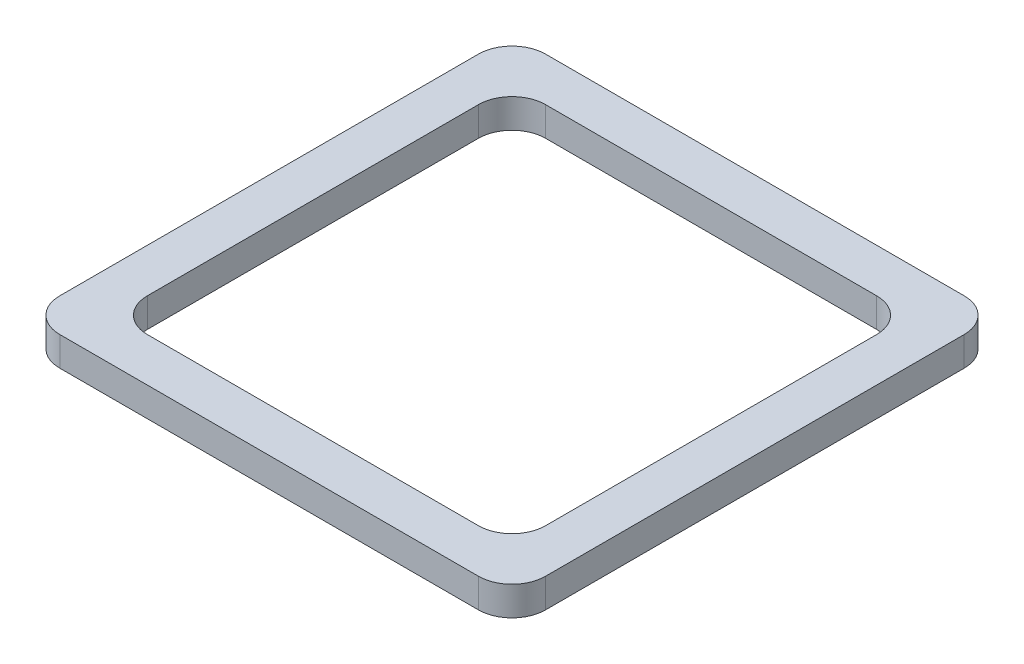
ISO-10303-21;
HEADER;
FILE_DESCRIPTION(('STEP AP214'),'2;1');
FILE_NAME('part.step','',(''),(''),'','','');
FILE_SCHEMA(('AUTOMOTIVE_DESIGN { 1 0 10303 214 1 1 1 1 }'));
ENDSEC;
DATA;
#1=APPLICATION_CONTEXT('core data for automotive mechanical design processes');
#2=APPLICATION_PROTOCOL_DEFINITION('international standard','automotive_design',2000,#1);
#3=PRODUCT_CONTEXT('',#1,'mechanical');
#4=PRODUCT('Part','Part','',(#3));
#5=PRODUCT_RELATED_PRODUCT_CATEGORY('part','',(#4));
#6=PRODUCT_DEFINITION_FORMATION('','',#4);
#7=PRODUCT_DEFINITION_CONTEXT('part definition',#1,'design');
#8=PRODUCT_DEFINITION('design','',#6,#7);
#9=PRODUCT_DEFINITION_SHAPE('','',#8);
#10=(LENGTH_UNIT() NAMED_UNIT(*) SI_UNIT(.MILLI.,.METRE.));
#11=(NAMED_UNIT(*) PLANE_ANGLE_UNIT() SI_UNIT($,.RADIAN.));
#12=(NAMED_UNIT(*) SI_UNIT($,.STERADIAN.) SOLID_ANGLE_UNIT());
#13=UNCERTAINTY_MEASURE_WITH_UNIT(LENGTH_MEASURE(1.E-05),#10,'distance_accuracy_value','');
#14=(GEOMETRIC_REPRESENTATION_CONTEXT(3) GLOBAL_UNCERTAINTY_ASSIGNED_CONTEXT((#13)) GLOBAL_UNIT_ASSIGNED_CONTEXT((#10,
#11,#12)) REPRESENTATION_CONTEXT('',''));
#15=CARTESIAN_POINT('',(0.,0.,0.));
#16=DIRECTION('',(0.,0.,1.));
#17=DIRECTION('',(1.,0.,0.));
#18=AXIS2_PLACEMENT_3D('',#15,#16,#17);
#19=CARTESIAN_POINT('',(0.,1.,8.325));
#20=DIRECTION('',(0.,0.,-1.));
#21=DIRECTION('',(-1.,0.,0.));
#22=AXIS2_PLACEMENT_3D('',#19,#20,#21);
#23=PLANE('',#22);
#24=DIRECTION('',(1.,0.,0.));
#25=VECTOR('',#24,1.);
#26=CARTESIAN_POINT('',(0.,1.,8.325));
#27=LINE('',#26,#25);
#28=CARTESIAN_POINT('',(-7.175,1.,8.325));
#29=VERTEX_POINT('',#28);
#30=CARTESIAN_POINT('',(7.175,1.,8.325));
#31=VERTEX_POINT('',#30);
#32=EDGE_CURVE('E191',#29,#31,#27,.T.);
#33=ORIENTED_EDGE('',*,*,#32,.F.);
#34=DIRECTION('',(0.,-1.,0.));
#35=VECTOR('',#34,1.);
#36=CARTESIAN_POINT('',(-7.175,0.,8.325));
#37=LINE('',#36,#35);
#38=CARTESIAN_POINT('',(-7.175,0.,8.325));
#39=VERTEX_POINT('',#38);
#40=EDGE_CURVE('E268',#29,#39,#37,.T.);
#41=ORIENTED_EDGE('',*,*,#40,.T.);
#42=DIRECTION('',(1.,0.,0.));
#43=VECTOR('',#42,1.);
#44=CARTESIAN_POINT('',(0.,0.,8.325));
#45=LINE('',#44,#43);
#46=CARTESIAN_POINT('',(7.175,0.,8.325));
#47=VERTEX_POINT('',#46);
#48=EDGE_CURVE('E219',#39,#47,#45,.T.);
#49=ORIENTED_EDGE('',*,*,#48,.T.);
#50=DIRECTION('',(0.,-1.,0.));
#51=VECTOR('',#50,1.);
#52=CARTESIAN_POINT('',(7.175,1.,8.325));
#53=LINE('',#52,#51);
#54=EDGE_CURVE('E266',#47,#31,#53,.F.);
#55=ORIENTED_EDGE('',*,*,#54,.T.);
#56=EDGE_LOOP('',(#33,#41,#49,#55));
#57=FACE_BOUND('',#56,.T.);
#58=ADVANCED_FACE('F36',(#57),#23,.F.);
#59=CARTESIAN_POINT('',(8.325,1.,0.));
#60=DIRECTION('',(-1.,0.,0.));
#61=DIRECTION('',(0.,0.,1.));
#62=AXIS2_PLACEMENT_3D('',#59,#60,#61);
#63=PLANE('',#62);
#64=DIRECTION('',(0.,0.,-1.));
#65=VECTOR('',#64,1.);
#66=CARTESIAN_POINT('',(8.325,1.,0.));
#67=LINE('',#66,#65);
#68=CARTESIAN_POINT('',(8.325,1.,7.175));
#69=VERTEX_POINT('',#68);
#70=CARTESIAN_POINT('',(8.325,1.,-7.175));
#71=VERTEX_POINT('',#70);
#72=EDGE_CURVE('E193',#69,#71,#67,.T.);
#73=ORIENTED_EDGE('',*,*,#72,.F.);
#74=DIRECTION('',(0.,-1.,0.));
#75=VECTOR('',#74,1.);
#76=CARTESIAN_POINT('',(8.325,1.,7.175));
#77=LINE('',#76,#75);
#78=CARTESIAN_POINT('',(8.325,0.,7.175));
#79=VERTEX_POINT('',#78);
#80=EDGE_CURVE('E11',#69,#79,#77,.T.);
#81=ORIENTED_EDGE('',*,*,#80,.T.);
#82=DIRECTION('',(0.,0.,-1.));
#83=VECTOR('',#82,1.);
#84=CARTESIAN_POINT('',(8.325,0.,0.));
#85=LINE('',#84,#83);
#86=CARTESIAN_POINT('',(8.325,0.,-7.175));
#87=VERTEX_POINT('',#86);
#88=EDGE_CURVE('E222',#79,#87,#85,.T.);
#89=ORIENTED_EDGE('',*,*,#88,.T.);
#90=DIRECTION('',(0.,-1.,0.));
#91=VECTOR('',#90,1.);
#92=CARTESIAN_POINT('',(8.325,1.,-7.175));
#93=LINE('',#92,#91);
#94=EDGE_CURVE('E44',#87,#71,#93,.F.);
#95=ORIENTED_EDGE('',*,*,#94,.T.);
#96=EDGE_LOOP('',(#73,#81,#89,#95));
#97=FACE_BOUND('',#96,.T.);
#98=ADVANCED_FACE('F284',(#97),#63,.F.);
#99=CARTESIAN_POINT('',(0.,1.,-8.325));
#100=DIRECTION('',(0.,0.,-1.));
#101=DIRECTION('',(-1.,0.,0.));
#102=AXIS2_PLACEMENT_3D('',#99,#100,#101);
#103=PLANE('',#102);
#104=DIRECTION('',(1.,0.,0.));
#105=VECTOR('',#104,1.);
#106=CARTESIAN_POINT('',(0.,0.,-8.325));
#107=LINE('',#106,#105);
#108=CARTESIAN_POINT('',(-7.175,0.,-8.325));
#109=VERTEX_POINT('',#108);
#110=CARTESIAN_POINT('',(7.175,0.,-8.325));
#111=VERTEX_POINT('',#110);
#112=EDGE_CURVE('E178',#109,#111,#107,.T.);
#113=ORIENTED_EDGE('',*,*,#112,.F.);
#114=DIRECTION('',(0.,-1.,0.));
#115=VECTOR('',#114,1.);
#116=CARTESIAN_POINT('',(-7.175,1.,-8.325));
#117=LINE('',#116,#115);
#118=CARTESIAN_POINT('',(-7.175,1.,-8.325));
#119=VERTEX_POINT('',#118);
#120=EDGE_CURVE('E257',#109,#119,#117,.F.);
#121=ORIENTED_EDGE('',*,*,#120,.T.);
#122=DIRECTION('',(1.,0.,0.));
#123=VECTOR('',#122,1.);
#124=CARTESIAN_POINT('',(0.,1.,-8.325));
#125=LINE('',#124,#123);
#126=CARTESIAN_POINT('',(7.175,1.,-8.325));
#127=VERTEX_POINT('',#126);
#128=EDGE_CURVE('E195',#119,#127,#125,.T.);
#129=ORIENTED_EDGE('',*,*,#128,.T.);
#130=DIRECTION('',(0.,-1.,0.));
#131=VECTOR('',#130,1.);
#132=CARTESIAN_POINT('',(7.175,0.,-8.325));
#133=LINE('',#132,#131);
#134=EDGE_CURVE('E254',#127,#111,#133,.T.);
#135=ORIENTED_EDGE('',*,*,#134,.T.);
#136=EDGE_LOOP('',(#113,#121,#129,#135));
#137=FACE_BOUND('',#136,.T.);
#138=ADVANCED_FACE('F291',(#137),#103,.T.);
#139=CARTESIAN_POINT('',(6.825,1.,0.));
#140=DIRECTION('',(-1.,0.,0.));
#141=DIRECTION('',(0.,0.,1.));
#142=AXIS2_PLACEMENT_3D('',#139,#140,#141);
#143=PLANE('',#142);
#144=DIRECTION('',(0.,0.,-1.));
#145=VECTOR('',#144,1.);
#146=CARTESIAN_POINT('',(6.825,0.,0.));
#147=LINE('',#146,#145);
#148=CARTESIAN_POINT('',(6.825,0.,5.675));
#149=VERTEX_POINT('',#148);
#150=CARTESIAN_POINT('',(6.825,0.,-5.675));
#151=VERTEX_POINT('',#150);
#152=EDGE_CURVE('E156',#149,#151,#147,.T.);
#153=ORIENTED_EDGE('',*,*,#152,.F.);
#154=DIRECTION('',(0.,-1.,0.));
#155=VECTOR('',#154,1.);
#156=CARTESIAN_POINT('',(6.825,1.,5.675));
#157=LINE('',#156,#155);
#158=CARTESIAN_POINT('',(6.825,1.,5.675));
#159=VERTEX_POINT('',#158);
#160=EDGE_CURVE('E150',#159,#149,#157,.T.);
#161=ORIENTED_EDGE('',*,*,#160,.F.);
#162=DIRECTION('',(0.,0.,-1.));
#163=VECTOR('',#162,1.);
#164=CARTESIAN_POINT('',(6.825,1.,0.));
#165=LINE('',#164,#163);
#166=CARTESIAN_POINT('',(6.825,1.,-5.675));
#167=VERTEX_POINT('',#166);
#168=EDGE_CURVE('E154',#159,#167,#165,.T.);
#169=ORIENTED_EDGE('',*,*,#168,.T.);
#170=DIRECTION('',(0.,-1.,0.));
#171=VECTOR('',#170,1.);
#172=CARTESIAN_POINT('',(6.825,1.,-5.675));
#173=LINE('',#172,#171);
#174=EDGE_CURVE('E201',#167,#151,#173,.T.);
#175=ORIENTED_EDGE('',*,*,#174,.T.);
#176=EDGE_LOOP('',(#153,#161,#169,#175));
#177=FACE_BOUND('',#176,.T.);
#178=ADVANCED_FACE('F152',(#177),#143,.T.);
#179=CARTESIAN_POINT('',(5.675,1.,5.675));
#180=DIRECTION('',(0.,-1.,0.));
#181=DIRECTION('',(0.,0.,-1.));
#182=AXIS2_PLACEMENT_3D('',#179,#180,#181);
#183=CYLINDRICAL_SURFACE('',#182,1.15);
#184=CARTESIAN_POINT('',(5.675,0.,5.675));
#185=DIRECTION('',(0.,1.,0.));
#186=DIRECTION('',(0.,0.,1.));
#187=AXIS2_PLACEMENT_3D('',#184,#185,#186);
#188=CIRCLE('',#187,1.15);
#189=CARTESIAN_POINT('',(5.675,0.,6.825));
#190=VERTEX_POINT('',#189);
#191=EDGE_CURVE('E203',#149,#190,#188,.F.);
#192=ORIENTED_EDGE('',*,*,#191,.T.);
#193=DIRECTION('',(0.,-1.,0.));
#194=VECTOR('',#193,1.);
#195=CARTESIAN_POINT('',(5.675,1.,6.825));
#196=LINE('',#195,#194);
#197=CARTESIAN_POINT('',(5.675,1.,6.825));
#198=VERTEX_POINT('',#197);
#199=EDGE_CURVE('E161',#198,#190,#196,.T.);
#200=ORIENTED_EDGE('',*,*,#199,.F.);
#201=CARTESIAN_POINT('',(5.675,1.,5.675));
#202=DIRECTION('',(0.,1.,0.));
#203=DIRECTION('',(0.,0.,1.));
#204=AXIS2_PLACEMENT_3D('',#201,#202,#203);
#205=CIRCLE('',#204,1.15);
#206=EDGE_CURVE('E164',#159,#198,#205,.F.);
#207=ORIENTED_EDGE('',*,*,#206,.F.);
#208=ORIENTED_EDGE('',*,*,#160,.T.);
#209=EDGE_LOOP('',(#192,#200,#207,#208));
#210=FACE_BOUND('',#209,.T.);
#211=ADVANCED_FACE('F165',(#210),#183,.F.);
#212=CARTESIAN_POINT('',(0.,1.,6.825));
#213=DIRECTION('',(0.,0.,-1.));
#214=DIRECTION('',(-1.,0.,0.));
#215=AXIS2_PLACEMENT_3D('',#212,#213,#214);
#216=PLANE('',#215);
#217=DIRECTION('',(1.,0.,0.));
#218=VECTOR('',#217,1.);
#219=CARTESIAN_POINT('',(0.,0.,6.825));
#220=LINE('',#219,#218);
#221=CARTESIAN_POINT('',(-5.675,0.,6.825));
#222=VERTEX_POINT('',#221);
#223=EDGE_CURVE('E205',#222,#190,#220,.T.);
#224=ORIENTED_EDGE('',*,*,#223,.F.);
#225=DIRECTION('',(0.,-1.,0.));
#226=VECTOR('',#225,1.);
#227=CARTESIAN_POINT('',(-5.675,1.,6.825));
#228=LINE('',#227,#226);
#229=CARTESIAN_POINT('',(-5.675,1.,6.825));
#230=VERTEX_POINT('',#229);
#231=EDGE_CURVE('E239',#230,#222,#228,.T.);
#232=ORIENTED_EDGE('',*,*,#231,.F.);
#233=DIRECTION('',(1.,0.,0.));
#234=VECTOR('',#233,1.);
#235=CARTESIAN_POINT('',(0.,1.,6.825));
#236=LINE('',#235,#234);
#237=EDGE_CURVE('E169',#230,#198,#236,.T.);
#238=ORIENTED_EDGE('',*,*,#237,.T.);
#239=ORIENTED_EDGE('',*,*,#199,.T.);
#240=EDGE_LOOP('',(#224,#232,#238,#239));
#241=FACE_BOUND('',#240,.T.);
#242=ADVANCED_FACE('F336',(#241),#216,.T.);
#243=CARTESIAN_POINT('',(-5.675,1.,5.675));
#244=DIRECTION('',(0.,-1.,0.));
#245=DIRECTION('',(0.,0.,-1.));
#246=AXIS2_PLACEMENT_3D('',#243,#244,#245);
#247=CYLINDRICAL_SURFACE('',#246,1.15);
#248=CARTESIAN_POINT('',(-5.675,0.,5.675));
#249=DIRECTION('',(0.,1.,0.));
#250=DIRECTION('',(0.,0.,1.));
#251=AXIS2_PLACEMENT_3D('',#248,#249,#250);
#252=CIRCLE('',#251,1.15);
#253=CARTESIAN_POINT('',(-6.825,0.,5.675));
#254=VERTEX_POINT('',#253);
#255=EDGE_CURVE('E208',#222,#254,#252,.F.);
#256=ORIENTED_EDGE('',*,*,#255,.T.);
#257=DIRECTION('',(0.,-1.,0.));
#258=VECTOR('',#257,1.);
#259=CARTESIAN_POINT('',(-6.825,1.,5.675));
#260=LINE('',#259,#258);
#261=CARTESIAN_POINT('',(-6.825,1.,5.675));
#262=VERTEX_POINT('',#261);
#263=EDGE_CURVE('E236',#262,#254,#260,.T.);
#264=ORIENTED_EDGE('',*,*,#263,.F.);
#265=CARTESIAN_POINT('',(-5.675,1.,5.675));
#266=DIRECTION('',(0.,1.,0.));
#267=DIRECTION('',(0.,0.,1.));
#268=AXIS2_PLACEMENT_3D('',#265,#266,#267);
#269=CIRCLE('',#268,1.15);
#270=EDGE_CURVE('E182',#230,#262,#269,.F.);
#271=ORIENTED_EDGE('',*,*,#270,.F.);
#272=ORIENTED_EDGE('',*,*,#231,.T.);
#273=EDGE_LOOP('',(#256,#264,#271,#272));
#274=FACE_BOUND('',#273,.T.);
#275=ADVANCED_FACE('F332',(#274),#247,.F.);
#276=CARTESIAN_POINT('',(-6.825,1.,0.));
#277=DIRECTION('',(-1.,0.,0.));
#278=DIRECTION('',(0.,0.,1.));
#279=AXIS2_PLACEMENT_3D('',#276,#277,#278);
#280=PLANE('',#279);
#281=DIRECTION('',(0.,0.,-1.));
#282=VECTOR('',#281,1.);
#283=CARTESIAN_POINT('',(-6.825,0.,0.));
#284=LINE('',#283,#282);
#285=CARTESIAN_POINT('',(-6.825,0.,-5.675));
#286=VERTEX_POINT('',#285);
#287=EDGE_CURVE('E210',#254,#286,#284,.T.);
#288=ORIENTED_EDGE('',*,*,#287,.T.);
#289=DIRECTION('',(0.,-1.,0.));
#290=VECTOR('',#289,1.);
#291=CARTESIAN_POINT('',(-6.825,1.,-5.675));
#292=LINE('',#291,#290);
#293=CARTESIAN_POINT('',(-6.825,1.,-5.675));
#294=VERTEX_POINT('',#293);
#295=EDGE_CURVE('E233',#294,#286,#292,.T.);
#296=ORIENTED_EDGE('',*,*,#295,.F.);
#297=DIRECTION('',(0.,0.,-1.));
#298=VECTOR('',#297,1.);
#299=CARTESIAN_POINT('',(-6.825,1.,0.));
#300=LINE('',#299,#298);
#301=EDGE_CURVE('E184',#262,#294,#300,.T.);
#302=ORIENTED_EDGE('',*,*,#301,.F.);
#303=ORIENTED_EDGE('',*,*,#263,.T.);
#304=EDGE_LOOP('',(#288,#296,#302,#303));
#305=FACE_BOUND('',#304,.T.);
#306=ADVANCED_FACE('F328',(#305),#280,.F.);
#307=CARTESIAN_POINT('',(-5.675,1.,-5.675));
#308=DIRECTION('',(0.,-1.,0.));
#309=DIRECTION('',(0.,0.,-1.));
#310=AXIS2_PLACEMENT_3D('',#307,#308,#309);
#311=CYLINDRICAL_SURFACE('',#310,1.15);
#312=CARTESIAN_POINT('',(-5.675,0.,-5.675));
#313=DIRECTION('',(0.,1.,0.));
#314=DIRECTION('',(0.,0.,1.));
#315=AXIS2_PLACEMENT_3D('',#312,#313,#314);
#316=CIRCLE('',#315,1.15);
#317=CARTESIAN_POINT('',(-5.675,0.,-6.825));
#318=VERTEX_POINT('',#317);
#319=EDGE_CURVE('E212',#286,#318,#316,.F.);
#320=ORIENTED_EDGE('',*,*,#319,.T.);
#321=DIRECTION('',(0.,-1.,0.));
#322=VECTOR('',#321,1.);
#323=CARTESIAN_POINT('',(-5.675,1.,-6.825));
#324=LINE('',#323,#322);
#325=CARTESIAN_POINT('',(-5.675,1.,-6.825));
#326=VERTEX_POINT('',#325);
#327=EDGE_CURVE('E230',#326,#318,#324,.T.);
#328=ORIENTED_EDGE('',*,*,#327,.F.);
#329=CARTESIAN_POINT('',(-5.675,1.,-5.675));
#330=DIRECTION('',(0.,1.,0.));
#331=DIRECTION('',(0.,0.,1.));
#332=AXIS2_PLACEMENT_3D('',#329,#330,#331);
#333=CIRCLE('',#332,1.15);
#334=EDGE_CURVE('E186',#294,#326,#333,.F.);
#335=ORIENTED_EDGE('',*,*,#334,.F.);
#336=ORIENTED_EDGE('',*,*,#295,.T.);
#337=EDGE_LOOP('',(#320,#328,#335,#336));
#338=FACE_BOUND('',#337,.T.);
#339=ADVANCED_FACE('F324',(#338),#311,.F.);
#340=CARTESIAN_POINT('',(0.,1.,-6.825));
#341=DIRECTION('',(0.,0.,-1.));
#342=DIRECTION('',(-1.,0.,0.));
#343=AXIS2_PLACEMENT_3D('',#340,#341,#342);
#344=PLANE('',#343);
#345=DIRECTION('',(1.,0.,0.));
#346=VECTOR('',#345,1.);
#347=CARTESIAN_POINT('',(0.,0.,-6.825));
#348=LINE('',#347,#346);
#349=CARTESIAN_POINT('',(5.675,0.,-6.825));
#350=VERTEX_POINT('',#349);
#351=EDGE_CURVE('E214',#318,#350,#348,.T.);
#352=ORIENTED_EDGE('',*,*,#351,.T.);
#353=DIRECTION('',(0.,-1.,0.));
#354=VECTOR('',#353,1.);
#355=CARTESIAN_POINT('',(5.675,1.,-6.825));
#356=LINE('',#355,#354);
#357=CARTESIAN_POINT('',(5.675,1.,-6.825));
#358=VERTEX_POINT('',#357);
#359=EDGE_CURVE('E227',#358,#350,#356,.T.);
#360=ORIENTED_EDGE('',*,*,#359,.F.);
#361=DIRECTION('',(1.,0.,0.));
#362=VECTOR('',#361,1.);
#363=CARTESIAN_POINT('',(0.,1.,-6.825));
#364=LINE('',#363,#362);
#365=EDGE_CURVE('E188',#326,#358,#364,.T.);
#366=ORIENTED_EDGE('',*,*,#365,.F.);
#367=ORIENTED_EDGE('',*,*,#327,.T.);
#368=EDGE_LOOP('',(#352,#360,#366,#367));
#369=FACE_BOUND('',#368,.T.);
#370=ADVANCED_FACE('F320',(#369),#344,.F.);
#371=CARTESIAN_POINT('',(5.675,1.,-5.675));
#372=DIRECTION('',(0.,-1.,0.));
#373=DIRECTION('',(0.,0.,-1.));
#374=AXIS2_PLACEMENT_3D('',#371,#372,#373);
#375=CYLINDRICAL_SURFACE('',#374,1.15);
#376=CARTESIAN_POINT('',(5.675,0.,-5.675));
#377=DIRECTION('',(0.,1.,0.));
#378=DIRECTION('',(0.,0.,1.));
#379=AXIS2_PLACEMENT_3D('',#376,#377,#378);
#380=CIRCLE('',#379,1.15);
#381=EDGE_CURVE('E216',#350,#151,#380,.F.);
#382=ORIENTED_EDGE('',*,*,#381,.T.);
#383=ORIENTED_EDGE('',*,*,#174,.F.);
#384=CARTESIAN_POINT('',(5.675,1.,-5.675));
#385=DIRECTION('',(0.,1.,0.));
#386=DIRECTION('',(0.,0.,1.));
#387=AXIS2_PLACEMENT_3D('',#384,#385,#386);
#388=CIRCLE('',#387,1.15);
#389=EDGE_CURVE('E173',#358,#167,#388,.F.);
#390=ORIENTED_EDGE('',*,*,#389,.F.);
#391=ORIENTED_EDGE('',*,*,#359,.T.);
#392=EDGE_LOOP('',(#382,#383,#390,#391));
#393=FACE_BOUND('',#392,.T.);
#394=ADVANCED_FACE('F317',(#393),#375,.F.);
#395=CARTESIAN_POINT('',(-8.325,1.,0.));
#396=DIRECTION('',(-1.,0.,0.));
#397=DIRECTION('',(0.,0.,1.));
#398=AXIS2_PLACEMENT_3D('',#395,#396,#397);
#399=PLANE('',#398);
#400=DIRECTION('',(0.,0.,-1.));
#401=VECTOR('',#400,1.);
#402=CARTESIAN_POINT('',(-8.325,1.,0.));
#403=LINE('',#402,#401);
#404=CARTESIAN_POINT('',(-8.325,1.,7.175));
#405=VERTEX_POINT('',#404);
#406=CARTESIAN_POINT('',(-8.325,1.,-7.175));
#407=VERTEX_POINT('',#406);
#408=EDGE_CURVE('E198',#405,#407,#403,.T.);
#409=ORIENTED_EDGE('',*,*,#408,.T.);
#410=DIRECTION('',(0.,-1.,0.));
#411=VECTOR('',#410,1.);
#412=CARTESIAN_POINT('',(-8.325,1.,-7.175));
#413=LINE('',#412,#411);
#414=CARTESIAN_POINT('',(-8.325,0.,-7.175));
#415=VERTEX_POINT('',#414);
#416=EDGE_CURVE('E243',#407,#415,#413,.T.);
#417=ORIENTED_EDGE('',*,*,#416,.T.);
#418=DIRECTION('',(0.,0.,-1.));
#419=VECTOR('',#418,1.);
#420=CARTESIAN_POINT('',(-8.325,0.,0.));
#421=LINE('',#420,#419);
#422=CARTESIAN_POINT('',(-8.325,0.,7.175));
#423=VERTEX_POINT('',#422);
#424=EDGE_CURVE('E175',#423,#415,#421,.T.);
#425=ORIENTED_EDGE('',*,*,#424,.F.);
#426=DIRECTION('',(0.,-1.,0.));
#427=VECTOR('',#426,1.);
#428=CARTESIAN_POINT('',(-8.325,1.,7.175));
#429=LINE('',#428,#427);
#430=EDGE_CURVE('E160',#423,#405,#429,.F.);
#431=ORIENTED_EDGE('',*,*,#430,.T.);
#432=EDGE_LOOP('',(#409,#417,#425,#431));
#433=FACE_BOUND('',#432,.T.);
#434=ADVANCED_FACE('F298',(#433),#399,.T.);
#435=CARTESIAN_POINT('',(0.,1.,0.));
#436=DIRECTION('',(0.,1.,0.));
#437=DIRECTION('',(0.,0.,1.));
#438=AXIS2_PLACEMENT_3D('',#435,#436,#437);
#439=PLANE('',#438);
#440=ORIENTED_EDGE('',*,*,#168,.F.);
#441=ORIENTED_EDGE('',*,*,#206,.T.);
#442=ORIENTED_EDGE('',*,*,#237,.F.);
#443=ORIENTED_EDGE('',*,*,#270,.T.);
#444=ORIENTED_EDGE('',*,*,#301,.T.);
#445=ORIENTED_EDGE('',*,*,#334,.T.);
#446=ORIENTED_EDGE('',*,*,#365,.T.);
#447=ORIENTED_EDGE('',*,*,#389,.T.);
#448=EDGE_LOOP('',(#440,#441,#442,#443,#444,#445,#446,#447));
#449=FACE_BOUND('',#448,.T.);
#450=ORIENTED_EDGE('',*,*,#128,.F.);
#451=CARTESIAN_POINT('',(-7.175,1.,-7.175));
#452=DIRECTION('',(0.,1.,0.));
#453=DIRECTION('',(0.,0.,1.));
#454=AXIS2_PLACEMENT_3D('',#451,#452,#453);
#455=CIRCLE('',#454,1.15);
#456=EDGE_CURVE('E264',#119,#407,#455,.T.);
#457=ORIENTED_EDGE('',*,*,#456,.T.);
#458=ORIENTED_EDGE('',*,*,#408,.F.);
#459=CARTESIAN_POINT('',(-7.175,1.,7.175));
#460=DIRECTION('',(0.,1.,0.));
#461=DIRECTION('',(0.,0.,1.));
#462=AXIS2_PLACEMENT_3D('',#459,#460,#461);
#463=CIRCLE('',#462,1.15);
#464=EDGE_CURVE('E262',#405,#29,#463,.T.);
#465=ORIENTED_EDGE('',*,*,#464,.T.);
#466=ORIENTED_EDGE('',*,*,#32,.T.);
#467=CARTESIAN_POINT('',(7.175,1.,7.175));
#468=DIRECTION('',(0.,1.,0.));
#469=DIRECTION('',(0.,0.,1.));
#470=AXIS2_PLACEMENT_3D('',#467,#468,#469);
#471=CIRCLE('',#470,1.15);
#472=EDGE_CURVE('E57',#31,#69,#471,.T.);
#473=ORIENTED_EDGE('',*,*,#472,.T.);
#474=ORIENTED_EDGE('',*,*,#72,.T.);
#475=CARTESIAN_POINT('',(7.175,1.,-7.175));
#476=DIRECTION('',(0.,1.,0.));
#477=DIRECTION('',(0.,0.,1.));
#478=AXIS2_PLACEMENT_3D('',#475,#476,#477);
#479=CIRCLE('',#478,1.15);
#480=EDGE_CURVE('E259',#71,#127,#479,.T.);
#481=ORIENTED_EDGE('',*,*,#480,.T.);
#482=EDGE_LOOP('',(#450,#457,#458,#465,#466,#473,#474,#481));
#483=FACE_BOUND('',#482,.T.);
#484=ADVANCED_FACE('F171',(#449,#483),#439,.T.);
#485=CARTESIAN_POINT('',(0.,0.,0.));
#486=DIRECTION('',(0.,1.,0.));
#487=DIRECTION('',(0.,0.,1.));
#488=AXIS2_PLACEMENT_3D('',#485,#486,#487);
#489=PLANE('',#488);
#490=ORIENTED_EDGE('',*,*,#152,.T.);
#491=ORIENTED_EDGE('',*,*,#381,.F.);
#492=ORIENTED_EDGE('',*,*,#351,.F.);
#493=ORIENTED_EDGE('',*,*,#319,.F.);
#494=ORIENTED_EDGE('',*,*,#287,.F.);
#495=ORIENTED_EDGE('',*,*,#255,.F.);
#496=ORIENTED_EDGE('',*,*,#223,.T.);
#497=ORIENTED_EDGE('',*,*,#191,.F.);
#498=EDGE_LOOP('',(#490,#491,#492,#493,#494,#495,#496,#497));
#499=FACE_BOUND('',#498,.T.);
#500=ORIENTED_EDGE('',*,*,#424,.T.);
#501=CARTESIAN_POINT('',(-7.175,0.,-7.175));
#502=DIRECTION('',(0.,1.,0.));
#503=DIRECTION('',(0.,0.,1.));
#504=AXIS2_PLACEMENT_3D('',#501,#502,#503);
#505=CIRCLE('',#504,1.15);
#506=EDGE_CURVE('E252',#415,#109,#505,.F.);
#507=ORIENTED_EDGE('',*,*,#506,.T.);
#508=ORIENTED_EDGE('',*,*,#112,.T.);
#509=CARTESIAN_POINT('',(7.175,0.,-7.175));
#510=DIRECTION('',(0.,1.,0.));
#511=DIRECTION('',(0.,0.,1.));
#512=AXIS2_PLACEMENT_3D('',#509,#510,#511);
#513=CIRCLE('',#512,1.15);
#514=EDGE_CURVE('E246',#111,#87,#513,.F.);
#515=ORIENTED_EDGE('',*,*,#514,.T.);
#516=ORIENTED_EDGE('',*,*,#88,.F.);
#517=CARTESIAN_POINT('',(7.175,0.,7.175));
#518=DIRECTION('',(0.,1.,0.));
#519=DIRECTION('',(0.,0.,1.));
#520=AXIS2_PLACEMENT_3D('',#517,#518,#519);
#521=CIRCLE('',#520,1.15);
#522=EDGE_CURVE('E248',#79,#47,#521,.F.);
#523=ORIENTED_EDGE('',*,*,#522,.T.);
#524=ORIENTED_EDGE('',*,*,#48,.F.);
#525=CARTESIAN_POINT('',(-7.175,0.,7.175));
#526=DIRECTION('',(0.,1.,0.));
#527=DIRECTION('',(0.,0.,1.));
#528=AXIS2_PLACEMENT_3D('',#525,#526,#527);
#529=CIRCLE('',#528,1.15);
#530=EDGE_CURVE('E250',#39,#423,#529,.F.);
#531=ORIENTED_EDGE('',*,*,#530,.T.);
#532=EDGE_LOOP('',(#500,#507,#508,#515,#516,#523,#524,#531));
#533=FACE_BOUND('',#532,.T.);
#534=ADVANCED_FACE('F278',(#499,#533),#489,.F.);
#535=CARTESIAN_POINT('',(-7.175,1.,-7.175));
#536=DIRECTION('',(0.,-1.,0.));
#537=DIRECTION('',(0.,0.,-1.));
#538=AXIS2_PLACEMENT_3D('',#535,#536,#537);
#539=CYLINDRICAL_SURFACE('',#538,1.15);
#540=ORIENTED_EDGE('',*,*,#456,.F.);
#541=ORIENTED_EDGE('',*,*,#120,.F.);
#542=ORIENTED_EDGE('',*,*,#506,.F.);
#543=ORIENTED_EDGE('',*,*,#416,.F.);
#544=EDGE_LOOP('',(#540,#541,#542,#543));
#545=FACE_BOUND('',#544,.T.);
#546=ADVANCED_FACE('F296',(#545),#539,.T.);
#547=CARTESIAN_POINT('',(-7.175,1.,7.175));
#548=DIRECTION('',(0.,1.,0.));
#549=DIRECTION('',(0.,0.,1.));
#550=AXIS2_PLACEMENT_3D('',#547,#548,#549);
#551=CYLINDRICAL_SURFACE('',#550,1.15);
#552=ORIENTED_EDGE('',*,*,#464,.F.);
#553=ORIENTED_EDGE('',*,*,#430,.F.);
#554=ORIENTED_EDGE('',*,*,#530,.F.);
#555=ORIENTED_EDGE('',*,*,#40,.F.);
#556=EDGE_LOOP('',(#552,#553,#554,#555));
#557=FACE_BOUND('',#556,.T.);
#558=ADVANCED_FACE('F301',(#557),#551,.T.);
#559=CARTESIAN_POINT('',(7.175,1.,7.175));
#560=DIRECTION('',(0.,-1.,0.));
#561=DIRECTION('',(0.,0.,-1.));
#562=AXIS2_PLACEMENT_3D('',#559,#560,#561);
#563=CYLINDRICAL_SURFACE('',#562,1.15);
#564=ORIENTED_EDGE('',*,*,#472,.F.);
#565=ORIENTED_EDGE('',*,*,#54,.F.);
#566=ORIENTED_EDGE('',*,*,#522,.F.);
#567=ORIENTED_EDGE('',*,*,#80,.F.);
#568=EDGE_LOOP('',(#564,#565,#566,#567));
#569=FACE_BOUND('',#568,.T.);
#570=ADVANCED_FACE('F283',(#569),#563,.T.);
#571=CARTESIAN_POINT('',(7.175,1.,-7.175));
#572=DIRECTION('',(0.,1.,0.));
#573=DIRECTION('',(0.,0.,1.));
#574=AXIS2_PLACEMENT_3D('',#571,#572,#573);
#575=CYLINDRICAL_SURFACE('',#574,1.15);
#576=ORIENTED_EDGE('',*,*,#480,.F.);
#577=ORIENTED_EDGE('',*,*,#94,.F.);
#578=ORIENTED_EDGE('',*,*,#514,.F.);
#579=ORIENTED_EDGE('',*,*,#134,.F.);
#580=EDGE_LOOP('',(#576,#577,#578,#579));
#581=FACE_BOUND('',#580,.T.);
#582=ADVANCED_FACE('F38',(#581),#575,.T.);
#583=CLOSED_SHELL('',(#58,#98,#138,#178,#211,#242,#275,#306,#339,#370,#394,#434,#484,#534,#546,
#558,#570,#582));
#584=MANIFOLD_SOLID_BREP('B2',#583);
#585=ADVANCED_BREP_SHAPE_REPRESENTATION('',(#18,#584),#14);
#586=SHAPE_DEFINITION_REPRESENTATION(#9,#585);
ENDSEC;
END-ISO-10303-21;
